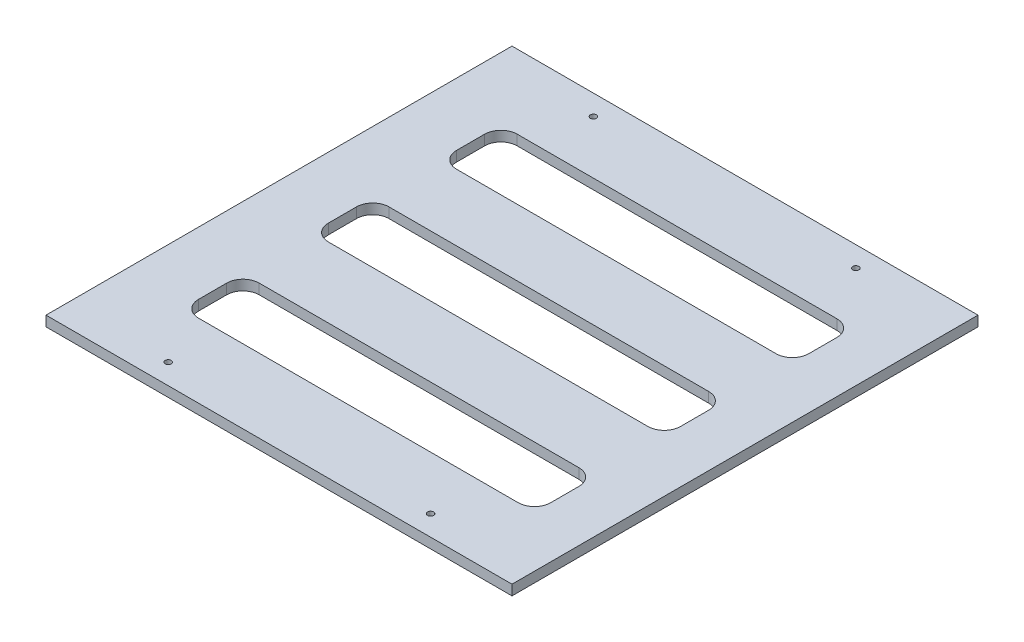
ISO-10303-21;
HEADER;
FILE_DESCRIPTION(('STEP AP214'),'2;1');
FILE_NAME('part.step','',(''),(''),'','','');
FILE_SCHEMA(('AUTOMOTIVE_DESIGN { 1 0 10303 214 1 1 1 1 }'));
ENDSEC;
DATA;
#1=APPLICATION_CONTEXT('core data for automotive mechanical design processes');
#2=APPLICATION_PROTOCOL_DEFINITION('international standard','automotive_design',2000,#1);
#3=PRODUCT_CONTEXT('',#1,'mechanical');
#4=PRODUCT('Part','Part','',(#3));
#5=PRODUCT_RELATED_PRODUCT_CATEGORY('part','',(#4));
#6=PRODUCT_DEFINITION_FORMATION('','',#4);
#7=PRODUCT_DEFINITION_CONTEXT('part definition',#1,'design');
#8=PRODUCT_DEFINITION('design','',#6,#7);
#9=PRODUCT_DEFINITION_SHAPE('','',#8);
#10=(LENGTH_UNIT() NAMED_UNIT(*) SI_UNIT(.MILLI.,.METRE.));
#11=(NAMED_UNIT(*) PLANE_ANGLE_UNIT() SI_UNIT($,.RADIAN.));
#12=(NAMED_UNIT(*) SI_UNIT($,.STERADIAN.) SOLID_ANGLE_UNIT());
#13=UNCERTAINTY_MEASURE_WITH_UNIT(LENGTH_MEASURE(1.E-05),#10,'distance_accuracy_value','');
#14=(GEOMETRIC_REPRESENTATION_CONTEXT(3) GLOBAL_UNCERTAINTY_ASSIGNED_CONTEXT((#13)) GLOBAL_UNIT_ASSIGNED_CONTEXT((#10,
#11,#12)) REPRESENTATION_CONTEXT('',''));
#15=CARTESIAN_POINT('',(0.,0.,0.));
#16=DIRECTION('',(0.,0.,1.));
#17=DIRECTION('',(1.,0.,0.));
#18=AXIS2_PLACEMENT_3D('',#15,#16,#17);
#19=CARTESIAN_POINT('',(0.,5.,0.));
#20=DIRECTION('',(0.,1.,0.));
#21=DIRECTION('',(0.,0.,1.));
#22=AXIS2_PLACEMENT_3D('',#19,#20,#21);
#23=PLANE('',#22);
#24=CARTESIAN_POINT('',(195.832686866874,5.,44.1979579462526));
#25=DIRECTION('',(0.,1.,0.));
#26=DIRECTION('',(0.,0.,1.));
#27=AXIS2_PLACEMENT_3D('',#24,#25,#26);
#28=CIRCLE('',#27,8.);
#29=CARTESIAN_POINT('',(203.832686866874,5.,44.1979579462527));
#30=VERTEX_POINT('',#29);
#31=CARTESIAN_POINT('',(195.832686866874,5.,36.1979579462526));
#32=VERTEX_POINT('',#31);
#33=EDGE_CURVE('E58',#30,#32,#28,.T.);
#34=ORIENTED_EDGE('',*,*,#33,.F.);
#35=DIRECTION('',(0.,0.,-1.));
#36=VECTOR('',#35,1.);
#37=CARTESIAN_POINT('',(203.832686866874,5.,44.1979579462527));
#38=LINE('',#37,#36);
#39=CARTESIAN_POINT('',(203.832686866874,5.,58.0273073000611));
#40=VERTEX_POINT('',#39);
#41=EDGE_CURVE('E253',#40,#30,#38,.T.);
#42=ORIENTED_EDGE('',*,*,#41,.F.);
#43=CARTESIAN_POINT('',(195.832686866874,5.,58.0273073000611));
#44=DIRECTION('',(0.,1.,0.));
#45=DIRECTION('',(0.,0.,1.));
#46=AXIS2_PLACEMENT_3D('',#43,#44,#45);
#47=CIRCLE('',#46,8.);
#48=CARTESIAN_POINT('',(195.832686866874,5.,66.0273073000611));
#49=VERTEX_POINT('',#48);
#50=EDGE_CURVE('E257',#49,#40,#47,.T.);
#51=ORIENTED_EDGE('',*,*,#50,.F.);
#52=DIRECTION('',(1.,0.,0.));
#53=VECTOR('',#52,1.);
#54=CARTESIAN_POINT('',(38.7603161369647,5.,66.0273073000611));
#55=LINE('',#54,#53);
#56=CARTESIAN_POINT('',(38.7603161369647,5.,66.0273073000611));
#57=VERTEX_POINT('',#56);
#58=EDGE_CURVE('E296',#57,#49,#55,.T.);
#59=ORIENTED_EDGE('',*,*,#58,.F.);
#60=CARTESIAN_POINT('',(38.7603161369646,5.,58.0273073000611));
#61=DIRECTION('',(0.,1.,0.));
#62=DIRECTION('',(0.,0.,1.));
#63=AXIS2_PLACEMENT_3D('',#60,#61,#62);
#64=CIRCLE('',#63,8.);
#65=CARTESIAN_POINT('',(30.7603161369646,5.,58.0273073000611));
#66=VERTEX_POINT('',#65);
#67=EDGE_CURVE('E292',#66,#57,#64,.T.);
#68=ORIENTED_EDGE('',*,*,#67,.F.);
#69=DIRECTION('',(0.,0.,1.));
#70=VECTOR('',#69,1.);
#71=CARTESIAN_POINT('',(30.7603161369646,5.,44.1979579462527));
#72=LINE('',#71,#70);
#73=CARTESIAN_POINT('',(30.7603161369646,5.,44.1979579462527));
#74=VERTEX_POINT('',#73);
#75=EDGE_CURVE('E288',#74,#66,#72,.T.);
#76=ORIENTED_EDGE('',*,*,#75,.F.);
#77=CARTESIAN_POINT('',(38.7603161369646,5.,44.1979579462526));
#78=DIRECTION('',(0.,1.,0.));
#79=DIRECTION('',(0.,0.,1.));
#80=AXIS2_PLACEMENT_3D('',#77,#78,#79);
#81=CIRCLE('',#80,8.);
#82=CARTESIAN_POINT('',(38.7603161369647,5.,36.1979579462526));
#83=VERTEX_POINT('',#82);
#84=EDGE_CURVE('E284',#83,#74,#81,.T.);
#85=ORIENTED_EDGE('',*,*,#84,.F.);
#86=DIRECTION('',(-1.,0.,0.));
#87=VECTOR('',#86,1.);
#88=CARTESIAN_POINT('',(38.7603161369647,5.,36.1979579462526));
#89=LINE('',#88,#87);
#90=EDGE_CURVE('E281',#32,#83,#89,.T.);
#91=ORIENTED_EDGE('',*,*,#90,.F.);
#92=EDGE_LOOP('',(#34,#42,#51,#59,#68,#76,#85,#91));
#93=FACE_BOUND('',#92,.T.);
#94=CARTESIAN_POINT('',(195.832686866874,5.,184.802042053747));
#95=DIRECTION('',(0.,1.,0.));
#96=DIRECTION('',(0.,0.,-1.));
#97=AXIS2_PLACEMENT_3D('',#94,#95,#96);
#98=CIRCLE('',#97,8.00000000000001);
#99=CARTESIAN_POINT('',(195.832686866874,5.,192.802042053747));
#100=VERTEX_POINT('',#99);
#101=CARTESIAN_POINT('',(203.832686866874,5.,184.802042053747));
#102=VERTEX_POINT('',#101);
#103=EDGE_CURVE('E66',#100,#102,#98,.T.);
#104=ORIENTED_EDGE('',*,*,#103,.F.);
#105=DIRECTION('',(1.,0.,0.));
#106=VECTOR('',#105,1.);
#107=CARTESIAN_POINT('',(38.7603161369646,5.,192.802042053747));
#108=LINE('',#107,#106);
#109=CARTESIAN_POINT('',(38.7603161369646,5.,192.802042053747));
#110=VERTEX_POINT('',#109);
#111=EDGE_CURVE('E350',#110,#100,#108,.T.);
#112=ORIENTED_EDGE('',*,*,#111,.F.);
#113=CARTESIAN_POINT('',(38.7603161369646,5.,184.802042053747));
#114=DIRECTION('',(0.,1.,0.));
#115=DIRECTION('',(0.,0.,-1.));
#116=AXIS2_PLACEMENT_3D('',#113,#114,#115);
#117=CIRCLE('',#116,8.);
#118=CARTESIAN_POINT('',(30.7603161369646,5.,184.802042053747));
#119=VERTEX_POINT('',#118);
#120=EDGE_CURVE('E354',#119,#110,#117,.T.);
#121=ORIENTED_EDGE('',*,*,#120,.F.);
#122=DIRECTION('',(0.,0.,1.));
#123=VECTOR('',#122,1.);
#124=CARTESIAN_POINT('',(30.7603161369646,5.,184.802042053747));
#125=LINE('',#124,#123);
#126=CARTESIAN_POINT('',(30.7603161369646,5.,170.972692699939));
#127=VERTEX_POINT('',#126);
#128=EDGE_CURVE('E359',#127,#119,#125,.T.);
#129=ORIENTED_EDGE('',*,*,#128,.F.);
#130=CARTESIAN_POINT('',(38.7603161369646,5.,170.972692699939));
#131=DIRECTION('',(0.,1.,0.));
#132=DIRECTION('',(0.,0.,-1.));
#133=AXIS2_PLACEMENT_3D('',#130,#131,#132);
#134=CIRCLE('',#133,7.99999999999998);
#135=CARTESIAN_POINT('',(38.7603161369646,5.,162.972692699939));
#136=VERTEX_POINT('',#135);
#137=EDGE_CURVE('E363',#136,#127,#134,.T.);
#138=ORIENTED_EDGE('',*,*,#137,.F.);
#139=DIRECTION('',(-1.,0.,0.));
#140=VECTOR('',#139,1.);
#141=CARTESIAN_POINT('',(38.7603161369646,5.,162.972692699939));
#142=LINE('',#141,#140);
#143=CARTESIAN_POINT('',(195.832686866874,5.,162.972692699939));
#144=VERTEX_POINT('',#143);
#145=EDGE_CURVE('E367',#144,#136,#142,.T.);
#146=ORIENTED_EDGE('',*,*,#145,.F.);
#147=CARTESIAN_POINT('',(195.832686866874,5.,170.972692699939));
#148=DIRECTION('',(0.,1.,0.));
#149=DIRECTION('',(0.,0.,-1.));
#150=AXIS2_PLACEMENT_3D('',#147,#148,#149);
#151=CIRCLE('',#150,8.00000000000001);
#152=CARTESIAN_POINT('',(203.832686866874,5.,170.972692699939));
#153=VERTEX_POINT('',#152);
#154=EDGE_CURVE('E371',#153,#144,#151,.T.);
#155=ORIENTED_EDGE('',*,*,#154,.F.);
#156=DIRECTION('',(0.,0.,-1.));
#157=VECTOR('',#156,1.);
#158=CARTESIAN_POINT('',(203.832686866874,5.,184.802042053747));
#159=LINE('',#158,#157);
#160=EDGE_CURVE('E375',#102,#153,#159,.T.);
#161=ORIENTED_EDGE('',*,*,#160,.F.);
#162=EDGE_LOOP('',(#104,#112,#121,#129,#138,#146,#155,#161));
#163=FACE_BOUND('',#162,.T.);
#164=CARTESIAN_POINT('',(195.29,5.,106.653158155789));
#165=DIRECTION('',(0.,1.,0.));
#166=DIRECTION('',(0.,0.,1.));
#167=AXIS2_PLACEMENT_3D('',#164,#165,#166);
#168=CIRCLE('',#167,8.00000000000001);
#169=CARTESIAN_POINT('',(203.29,5.,106.653158155789));
#170=VERTEX_POINT('',#169);
#171=CARTESIAN_POINT('',(195.29,5.,98.6531581557891));
#172=VERTEX_POINT('',#171);
#173=EDGE_CURVE('E349',#170,#172,#168,.T.);
#174=ORIENTED_EDGE('',*,*,#173,.F.);
#175=DIRECTION('',(0.,0.,-1.));
#176=VECTOR('',#175,1.);
#177=CARTESIAN_POINT('',(203.29,5.,106.653158155789));
#178=LINE('',#177,#176);
#179=CARTESIAN_POINT('',(203.29,5.,120.482507509598));
#180=VERTEX_POINT('',#179);
#181=EDGE_CURVE('E437',#180,#170,#178,.T.);
#182=ORIENTED_EDGE('',*,*,#181,.F.);
#183=CARTESIAN_POINT('',(195.29,5.,120.482507509598));
#184=DIRECTION('',(0.,1.,0.));
#185=DIRECTION('',(0.,0.,1.));
#186=AXIS2_PLACEMENT_3D('',#183,#184,#185);
#187=CIRCLE('',#186,8.00000000000001);
#188=CARTESIAN_POINT('',(195.29,5.,128.482507509598));
#189=VERTEX_POINT('',#188);
#190=EDGE_CURVE('E441',#189,#180,#187,.T.);
#191=ORIENTED_EDGE('',*,*,#190,.F.);
#192=DIRECTION('',(1.,0.,0.));
#193=VECTOR('',#192,1.);
#194=CARTESIAN_POINT('',(38.22,5.,128.482507509598));
#195=LINE('',#194,#193);
#196=CARTESIAN_POINT('',(38.22,5.,128.482507509598));
#197=VERTEX_POINT('',#196);
#198=EDGE_CURVE('E446',#197,#189,#195,.T.);
#199=ORIENTED_EDGE('',*,*,#198,.F.);
#200=CARTESIAN_POINT('',(38.22,5.,120.482507509598));
#201=DIRECTION('',(0.,1.,0.));
#202=DIRECTION('',(0.,0.,1.));
#203=AXIS2_PLACEMENT_3D('',#200,#201,#202);
#204=CIRCLE('',#203,8.00000000000001);
#205=CARTESIAN_POINT('',(30.22,5.,120.482507509598));
#206=VERTEX_POINT('',#205);
#207=EDGE_CURVE('E450',#206,#197,#204,.T.);
#208=ORIENTED_EDGE('',*,*,#207,.F.);
#209=DIRECTION('',(0.,0.,1.));
#210=VECTOR('',#209,1.);
#211=CARTESIAN_POINT('',(30.22,5.,106.653158155789));
#212=LINE('',#211,#210);
#213=CARTESIAN_POINT('',(30.22,5.,106.653158155789));
#214=VERTEX_POINT('',#213);
#215=EDGE_CURVE('E454',#214,#206,#212,.T.);
#216=ORIENTED_EDGE('',*,*,#215,.F.);
#217=CARTESIAN_POINT('',(38.22,5.,106.653158155789));
#218=DIRECTION('',(0.,1.,0.));
#219=DIRECTION('',(0.,0.,1.));
#220=AXIS2_PLACEMENT_3D('',#217,#218,#219);
#221=CIRCLE('',#220,8.00000000000001);
#222=CARTESIAN_POINT('',(38.22,5.,98.6531581557891));
#223=VERTEX_POINT('',#222);
#224=EDGE_CURVE('E458',#223,#214,#221,.T.);
#225=ORIENTED_EDGE('',*,*,#224,.F.);
#226=DIRECTION('',(-1.,0.,0.));
#227=VECTOR('',#226,1.);
#228=CARTESIAN_POINT('',(38.22,5.,98.6531581557891));
#229=LINE('',#228,#227);
#230=EDGE_CURVE('E462',#172,#223,#229,.T.);
#231=ORIENTED_EDGE('',*,*,#230,.F.);
#232=EDGE_LOOP('',(#174,#182,#191,#199,#208,#216,#225,#231));
#233=FACE_BOUND('',#232,.T.);
#234=CARTESIAN_POINT('',(179.,5.,219.));
#235=DIRECTION('',(0.,1.,0.));
#236=DIRECTION('',(0.,0.,-1.));
#237=AXIS2_PLACEMENT_3D('',#234,#235,#236);
#238=CIRCLE('',#237,1.5);
#239=CARTESIAN_POINT('',(179.,5.,217.5));
#240=VERTEX_POINT('',#239);
#241=EDGE_CURVE('E506',#240,#240,#238,.T.);
#242=ORIENTED_EDGE('',*,*,#241,.F.);
#243=EDGE_LOOP('',(#242));
#244=FACE_BOUND('',#243,.T.);
#245=CARTESIAN_POINT('',(179.,5.,10.));
#246=DIRECTION('',(0.,1.,0.));
#247=DIRECTION('',(0.,0.,1.));
#248=AXIS2_PLACEMENT_3D('',#245,#246,#247);
#249=CIRCLE('',#248,1.5);
#250=CARTESIAN_POINT('',(179.,5.,11.5));
#251=VERTEX_POINT('',#250);
#252=EDGE_CURVE('E522',#251,#251,#249,.T.);
#253=ORIENTED_EDGE('',*,*,#252,.F.);
#254=EDGE_LOOP('',(#253));
#255=FACE_BOUND('',#254,.T.);
#256=DIRECTION('',(0.,0.,1.));
#257=VECTOR('',#256,1.);
#258=CARTESIAN_POINT('',(0.,5.,0.));
#259=LINE('',#258,#257);
#260=CARTESIAN_POINT('',(0.,5.,0.));
#261=VERTEX_POINT('',#260);
#262=CARTESIAN_POINT('',(0.,5.,229.));
#263=VERTEX_POINT('',#262);
#264=EDGE_CURVE('E530',#261,#263,#259,.T.);
#265=ORIENTED_EDGE('',*,*,#264,.T.);
#266=DIRECTION('',(1.,0.,0.));
#267=VECTOR('',#266,1.);
#268=CARTESIAN_POINT('',(0.,5.,229.));
#269=LINE('',#268,#267);
#270=CARTESIAN_POINT('',(229.,5.,229.));
#271=VERTEX_POINT('',#270);
#272=EDGE_CURVE('E534',#263,#271,#269,.T.);
#273=ORIENTED_EDGE('',*,*,#272,.T.);
#274=DIRECTION('',(0.,0.,-1.));
#275=VECTOR('',#274,1.);
#276=CARTESIAN_POINT('',(229.,5.,0.));
#277=LINE('',#276,#275);
#278=CARTESIAN_POINT('',(229.,5.,0.));
#279=VERTEX_POINT('',#278);
#280=EDGE_CURVE('E538',#271,#279,#277,.T.);
#281=ORIENTED_EDGE('',*,*,#280,.T.);
#282=DIRECTION('',(-1.,0.,0.));
#283=VECTOR('',#282,1.);
#284=CARTESIAN_POINT('',(0.,5.,0.));
#285=LINE('',#284,#283);
#286=EDGE_CURVE('E541',#279,#261,#285,.T.);
#287=ORIENTED_EDGE('',*,*,#286,.T.);
#288=EDGE_LOOP('',(#265,#273,#281,#287));
#289=FACE_BOUND('',#288,.T.);
#290=CARTESIAN_POINT('',(50.,5.,10.));
#291=DIRECTION('',(0.,1.,0.));
#292=DIRECTION('',(0.,0.,-1.));
#293=AXIS2_PLACEMENT_3D('',#290,#291,#292);
#294=CIRCLE('',#293,1.5);
#295=CARTESIAN_POINT('',(50.,5.,8.5));
#296=VERTEX_POINT('',#295);
#297=EDGE_CURVE('E514',#296,#296,#294,.T.);
#298=ORIENTED_EDGE('',*,*,#297,.F.);
#299=EDGE_LOOP('',(#298));
#300=FACE_BOUND('',#299,.T.);
#301=CARTESIAN_POINT('',(50.,5.,219.));
#302=DIRECTION('',(0.,1.,0.));
#303=DIRECTION('',(0.,0.,1.));
#304=AXIS2_PLACEMENT_3D('',#301,#302,#303);
#305=CIRCLE('',#304,1.5);
#306=CARTESIAN_POINT('',(50.,5.,220.5));
#307=VERTEX_POINT('',#306);
#308=EDGE_CURVE('E498',#307,#307,#305,.T.);
#309=ORIENTED_EDGE('',*,*,#308,.F.);
#310=EDGE_LOOP('',(#309));
#311=FACE_BOUND('',#310,.T.);
#312=ADVANCED_FACE('F42',(#93,#163,#233,#244,#255,#289,#300,#311),#23,.T.);
#313=CARTESIAN_POINT('',(0.,0.,0.));
#314=DIRECTION('',(0.,1.,0.));
#315=DIRECTION('',(0.,0.,1.));
#316=AXIS2_PLACEMENT_3D('',#313,#314,#315);
#317=PLANE('',#316);
#318=DIRECTION('',(0.,0.,-1.));
#319=VECTOR('',#318,1.);
#320=CARTESIAN_POINT('',(203.832686866874,0.,44.1979579462527));
#321=LINE('',#320,#319);
#322=CARTESIAN_POINT('',(203.832686866874,0.,58.0273073000611));
#323=VERTEX_POINT('',#322);
#324=CARTESIAN_POINT('',(203.832686866874,0.,44.1979579462527));
#325=VERTEX_POINT('',#324);
#326=EDGE_CURVE('E237',#323,#325,#321,.T.);
#327=ORIENTED_EDGE('',*,*,#326,.T.);
#328=CARTESIAN_POINT('',(195.832686866874,0.,44.1979579462526));
#329=DIRECTION('',(0.,1.,0.));
#330=DIRECTION('',(0.,0.,1.));
#331=AXIS2_PLACEMENT_3D('',#328,#329,#330);
#332=CIRCLE('',#331,8.);
#333=CARTESIAN_POINT('',(195.832686866874,0.,36.1979579462526));
#334=VERTEX_POINT('',#333);
#335=EDGE_CURVE('E230',#325,#334,#332,.T.);
#336=ORIENTED_EDGE('',*,*,#335,.T.);
#337=DIRECTION('',(-1.,0.,0.));
#338=VECTOR('',#337,1.);
#339=CARTESIAN_POINT('',(38.7603161369647,0.,36.1979579462526));
#340=LINE('',#339,#338);
#341=CARTESIAN_POINT('',(38.7603161369647,0.,36.1979579462526));
#342=VERTEX_POINT('',#341);
#343=EDGE_CURVE('E241',#334,#342,#340,.T.);
#344=ORIENTED_EDGE('',*,*,#343,.T.);
#345=CARTESIAN_POINT('',(38.7603161369646,0.,44.1979579462526));
#346=DIRECTION('',(0.,1.,0.));
#347=DIRECTION('',(0.,0.,1.));
#348=AXIS2_PLACEMENT_3D('',#345,#346,#347);
#349=CIRCLE('',#348,8.);
#350=CARTESIAN_POINT('',(30.7603161369646,0.,44.1979579462527));
#351=VERTEX_POINT('',#350);
#352=EDGE_CURVE('E246',#342,#351,#349,.T.);
#353=ORIENTED_EDGE('',*,*,#352,.T.);
#354=DIRECTION('',(0.,0.,1.));
#355=VECTOR('',#354,1.);
#356=CARTESIAN_POINT('',(30.7603161369646,0.,44.1979579462527));
#357=LINE('',#356,#355);
#358=CARTESIAN_POINT('',(30.7603161369646,0.,58.0273073000611));
#359=VERTEX_POINT('',#358);
#360=EDGE_CURVE('E262',#351,#359,#357,.T.);
#361=ORIENTED_EDGE('',*,*,#360,.T.);
#362=CARTESIAN_POINT('',(38.7603161369646,0.,58.0273073000611));
#363=DIRECTION('',(0.,1.,0.));
#364=DIRECTION('',(0.,0.,1.));
#365=AXIS2_PLACEMENT_3D('',#362,#363,#364);
#366=CIRCLE('',#365,8.);
#367=CARTESIAN_POINT('',(38.7603161369647,0.,66.0273073000611));
#368=VERTEX_POINT('',#367);
#369=EDGE_CURVE('E266',#359,#368,#366,.T.);
#370=ORIENTED_EDGE('',*,*,#369,.T.);
#371=DIRECTION('',(1.,0.,0.));
#372=VECTOR('',#371,1.);
#373=CARTESIAN_POINT('',(38.7603161369647,0.,66.0273073000611));
#374=LINE('',#373,#372);
#375=CARTESIAN_POINT('',(195.832686866874,0.,66.0273073000611));
#376=VERTEX_POINT('',#375);
#377=EDGE_CURVE('E270',#368,#376,#374,.T.);
#378=ORIENTED_EDGE('',*,*,#377,.T.);
#379=CARTESIAN_POINT('',(195.832686866874,0.,58.0273073000611));
#380=DIRECTION('',(0.,1.,0.));
#381=DIRECTION('',(0.,0.,1.));
#382=AXIS2_PLACEMENT_3D('',#379,#380,#381);
#383=CIRCLE('',#382,8.);
#384=EDGE_CURVE('E274',#376,#323,#383,.T.);
#385=ORIENTED_EDGE('',*,*,#384,.T.);
#386=EDGE_LOOP('',(#327,#336,#344,#353,#361,#370,#378,#385));
#387=FACE_BOUND('',#386,.T.);
#388=DIRECTION('',(1.,0.,0.));
#389=VECTOR('',#388,1.);
#390=CARTESIAN_POINT('',(38.7603161369646,0.,192.802042053747));
#391=LINE('',#390,#389);
#392=CARTESIAN_POINT('',(38.7603161369646,0.,192.802042053747));
#393=VERTEX_POINT('',#392);
#394=CARTESIAN_POINT('',(195.832686866874,0.,192.802042053747));
#395=VERTEX_POINT('',#394);
#396=EDGE_CURVE('E327',#393,#395,#391,.T.);
#397=ORIENTED_EDGE('',*,*,#396,.T.);
#398=CARTESIAN_POINT('',(195.832686866874,0.,184.802042053747));
#399=DIRECTION('',(0.,1.,0.));
#400=DIRECTION('',(0.,0.,-1.));
#401=AXIS2_PLACEMENT_3D('',#398,#399,#400);
#402=CIRCLE('',#401,8.00000000000001);
#403=CARTESIAN_POINT('',(203.832686866874,0.,184.802042053747));
#404=VERTEX_POINT('',#403);
#405=EDGE_CURVE('E355',#395,#404,#402,.T.);
#406=ORIENTED_EDGE('',*,*,#405,.T.);
#407=DIRECTION('',(0.,0.,-1.));
#408=VECTOR('',#407,1.);
#409=CARTESIAN_POINT('',(203.832686866874,0.,184.802042053747));
#410=LINE('',#409,#408);
#411=CARTESIAN_POINT('',(203.832686866874,0.,170.972692699939));
#412=VERTEX_POINT('',#411);
#413=EDGE_CURVE('E404',#404,#412,#410,.T.);
#414=ORIENTED_EDGE('',*,*,#413,.T.);
#415=CARTESIAN_POINT('',(195.832686866874,0.,170.972692699939));
#416=DIRECTION('',(0.,1.,0.));
#417=DIRECTION('',(0.,0.,-1.));
#418=AXIS2_PLACEMENT_3D('',#415,#416,#417);
#419=CIRCLE('',#418,8.00000000000001);
#420=CARTESIAN_POINT('',(195.832686866874,0.,162.972692699939));
#421=VERTEX_POINT('',#420);
#422=EDGE_CURVE('E400',#412,#421,#419,.T.);
#423=ORIENTED_EDGE('',*,*,#422,.T.);
#424=DIRECTION('',(-1.,0.,0.));
#425=VECTOR('',#424,1.);
#426=CARTESIAN_POINT('',(38.7603161369646,0.,162.972692699939));
#427=LINE('',#426,#425);
#428=CARTESIAN_POINT('',(38.7603161369646,0.,162.972692699939));
#429=VERTEX_POINT('',#428);
#430=EDGE_CURVE('E396',#421,#429,#427,.T.);
#431=ORIENTED_EDGE('',*,*,#430,.T.);
#432=CARTESIAN_POINT('',(38.7603161369646,0.,170.972692699939));
#433=DIRECTION('',(0.,1.,0.));
#434=DIRECTION('',(0.,0.,-1.));
#435=AXIS2_PLACEMENT_3D('',#432,#433,#434);
#436=CIRCLE('',#435,7.99999999999998);
#437=CARTESIAN_POINT('',(30.7603161369646,0.,170.972692699939));
#438=VERTEX_POINT('',#437);
#439=EDGE_CURVE('E392',#429,#438,#436,.T.);
#440=ORIENTED_EDGE('',*,*,#439,.T.);
#441=DIRECTION('',(0.,0.,1.));
#442=VECTOR('',#441,1.);
#443=CARTESIAN_POINT('',(30.7603161369646,0.,184.802042053747));
#444=LINE('',#443,#442);
#445=CARTESIAN_POINT('',(30.7603161369646,0.,184.802042053747));
#446=VERTEX_POINT('',#445);
#447=EDGE_CURVE('E388',#438,#446,#444,.T.);
#448=ORIENTED_EDGE('',*,*,#447,.T.);
#449=CARTESIAN_POINT('',(38.7603161369646,0.,184.802042053747));
#450=DIRECTION('',(0.,1.,0.));
#451=DIRECTION('',(0.,0.,-1.));
#452=AXIS2_PLACEMENT_3D('',#449,#450,#451);
#453=CIRCLE('',#452,8.);
#454=EDGE_CURVE('E384',#446,#393,#453,.T.);
#455=ORIENTED_EDGE('',*,*,#454,.T.);
#456=EDGE_LOOP('',(#397,#406,#414,#423,#431,#440,#448,#455));
#457=FACE_BOUND('',#456,.T.);
#458=DIRECTION('',(0.,0.,-1.));
#459=VECTOR('',#458,1.);
#460=CARTESIAN_POINT('',(203.29,0.,106.653158155789));
#461=LINE('',#460,#459);
#462=CARTESIAN_POINT('',(203.29,0.,120.482507509598));
#463=VERTEX_POINT('',#462);
#464=CARTESIAN_POINT('',(203.29,0.,106.653158155789));
#465=VERTEX_POINT('',#464);
#466=EDGE_CURVE('E415',#463,#465,#461,.T.);
#467=ORIENTED_EDGE('',*,*,#466,.T.);
#468=CARTESIAN_POINT('',(195.29,0.,106.653158155789));
#469=DIRECTION('',(0.,1.,0.));
#470=DIRECTION('',(0.,0.,1.));
#471=AXIS2_PLACEMENT_3D('',#468,#469,#470);
#472=CIRCLE('',#471,8.00000000000001);
#473=CARTESIAN_POINT('',(195.29,0.,98.6531581557891));
#474=VERTEX_POINT('',#473);
#475=EDGE_CURVE('E442',#465,#474,#472,.T.);
#476=ORIENTED_EDGE('',*,*,#475,.T.);
#477=DIRECTION('',(-1.,0.,0.));
#478=VECTOR('',#477,1.);
#479=CARTESIAN_POINT('',(38.22,0.,98.6531581557891));
#480=LINE('',#479,#478);
#481=CARTESIAN_POINT('',(38.22,0.,98.6531581557891));
#482=VERTEX_POINT('',#481);
#483=EDGE_CURVE('E491',#474,#482,#480,.T.);
#484=ORIENTED_EDGE('',*,*,#483,.T.);
#485=CARTESIAN_POINT('',(38.22,0.,106.653158155789));
#486=DIRECTION('',(0.,1.,0.));
#487=DIRECTION('',(0.,0.,1.));
#488=AXIS2_PLACEMENT_3D('',#485,#486,#487);
#489=CIRCLE('',#488,8.00000000000001);
#490=CARTESIAN_POINT('',(30.22,0.,106.653158155789));
#491=VERTEX_POINT('',#490);
#492=EDGE_CURVE('E487',#482,#491,#489,.T.);
#493=ORIENTED_EDGE('',*,*,#492,.T.);
#494=DIRECTION('',(0.,0.,1.));
#495=VECTOR('',#494,1.);
#496=CARTESIAN_POINT('',(30.22,0.,106.653158155789));
#497=LINE('',#496,#495);
#498=CARTESIAN_POINT('',(30.22,0.,120.482507509598));
#499=VERTEX_POINT('',#498);
#500=EDGE_CURVE('E483',#491,#499,#497,.T.);
#501=ORIENTED_EDGE('',*,*,#500,.T.);
#502=CARTESIAN_POINT('',(38.22,0.,120.482507509598));
#503=DIRECTION('',(0.,1.,0.));
#504=DIRECTION('',(0.,0.,1.));
#505=AXIS2_PLACEMENT_3D('',#502,#503,#504);
#506=CIRCLE('',#505,8.00000000000001);
#507=CARTESIAN_POINT('',(38.22,0.,128.482507509598));
#508=VERTEX_POINT('',#507);
#509=EDGE_CURVE('E479',#499,#508,#506,.T.);
#510=ORIENTED_EDGE('',*,*,#509,.T.);
#511=DIRECTION('',(1.,0.,0.));
#512=VECTOR('',#511,1.);
#513=CARTESIAN_POINT('',(38.22,0.,128.482507509598));
#514=LINE('',#513,#512);
#515=CARTESIAN_POINT('',(195.29,0.,128.482507509598));
#516=VERTEX_POINT('',#515);
#517=EDGE_CURVE('E475',#508,#516,#514,.T.);
#518=ORIENTED_EDGE('',*,*,#517,.T.);
#519=CARTESIAN_POINT('',(195.29,0.,120.482507509598));
#520=DIRECTION('',(0.,1.,0.));
#521=DIRECTION('',(0.,0.,1.));
#522=AXIS2_PLACEMENT_3D('',#519,#520,#521);
#523=CIRCLE('',#522,8.00000000000001);
#524=EDGE_CURVE('E471',#516,#463,#523,.T.);
#525=ORIENTED_EDGE('',*,*,#524,.T.);
#526=EDGE_LOOP('',(#467,#476,#484,#493,#501,#510,#518,#525));
#527=FACE_BOUND('',#526,.T.);
#528=DIRECTION('',(0.,0.,1.));
#529=VECTOR('',#528,1.);
#530=CARTESIAN_POINT('',(0.,0.,0.));
#531=LINE('',#530,#529);
#532=CARTESIAN_POINT('',(0.,0.,0.));
#533=VERTEX_POINT('',#532);
#534=CARTESIAN_POINT('',(0.,0.,229.));
#535=VERTEX_POINT('',#534);
#536=EDGE_CURVE('E526',#533,#535,#531,.T.);
#537=ORIENTED_EDGE('',*,*,#536,.F.);
#538=DIRECTION('',(-1.,0.,0.));
#539=VECTOR('',#538,1.);
#540=CARTESIAN_POINT('',(0.,0.,0.));
#541=LINE('',#540,#539);
#542=CARTESIAN_POINT('',(229.,0.,0.));
#543=VERTEX_POINT('',#542);
#544=EDGE_CURVE('E535',#543,#533,#541,.T.);
#545=ORIENTED_EDGE('',*,*,#544,.F.);
#546=DIRECTION('',(0.,0.,-1.));
#547=VECTOR('',#546,1.);
#548=CARTESIAN_POINT('',(229.,0.,0.));
#549=LINE('',#548,#547);
#550=CARTESIAN_POINT('',(229.,0.,229.));
#551=VERTEX_POINT('',#550);
#552=EDGE_CURVE('E551',#551,#543,#549,.T.);
#553=ORIENTED_EDGE('',*,*,#552,.F.);
#554=DIRECTION('',(1.,0.,0.));
#555=VECTOR('',#554,1.);
#556=CARTESIAN_POINT('',(0.,0.,229.));
#557=LINE('',#556,#555);
#558=EDGE_CURVE('E548',#535,#551,#557,.T.);
#559=ORIENTED_EDGE('',*,*,#558,.F.);
#560=EDGE_LOOP('',(#537,#545,#553,#559));
#561=FACE_BOUND('',#560,.T.);
#562=CARTESIAN_POINT('',(179.,0.,10.));
#563=DIRECTION('',(0.,1.,0.));
#564=DIRECTION('',(0.,0.,1.));
#565=AXIS2_PLACEMENT_3D('',#562,#563,#564);
#566=CIRCLE('',#565,1.5);
#567=CARTESIAN_POINT('',(179.,0.,11.5));
#568=VERTEX_POINT('',#567);
#569=EDGE_CURVE('E518',#568,#568,#566,.T.);
#570=ORIENTED_EDGE('',*,*,#569,.T.);
#571=EDGE_LOOP('',(#570));
#572=FACE_BOUND('',#571,.T.);
#573=CARTESIAN_POINT('',(50.,0.,10.));
#574=DIRECTION('',(0.,1.,0.));
#575=DIRECTION('',(0.,0.,-1.));
#576=AXIS2_PLACEMENT_3D('',#573,#574,#575);
#577=CIRCLE('',#576,1.5);
#578=CARTESIAN_POINT('',(50.,0.,8.5));
#579=VERTEX_POINT('',#578);
#580=EDGE_CURVE('E510',#579,#579,#577,.T.);
#581=ORIENTED_EDGE('',*,*,#580,.T.);
#582=EDGE_LOOP('',(#581));
#583=FACE_BOUND('',#582,.T.);
#584=CARTESIAN_POINT('',(179.,0.,219.));
#585=DIRECTION('',(0.,1.,0.));
#586=DIRECTION('',(0.,0.,-1.));
#587=AXIS2_PLACEMENT_3D('',#584,#585,#586);
#588=CIRCLE('',#587,1.5);
#589=CARTESIAN_POINT('',(179.,0.,217.5));
#590=VERTEX_POINT('',#589);
#591=EDGE_CURVE('E502',#590,#590,#588,.T.);
#592=ORIENTED_EDGE('',*,*,#591,.T.);
#593=EDGE_LOOP('',(#592));
#594=FACE_BOUND('',#593,.T.);
#595=CARTESIAN_POINT('',(50.,0.,219.));
#596=DIRECTION('',(0.,1.,0.));
#597=DIRECTION('',(0.,0.,1.));
#598=AXIS2_PLACEMENT_3D('',#595,#596,#597);
#599=CIRCLE('',#598,1.5);
#600=CARTESIAN_POINT('',(50.,0.,220.5));
#601=VERTEX_POINT('',#600);
#602=EDGE_CURVE('E306',#601,#601,#599,.T.);
#603=ORIENTED_EDGE('',*,*,#602,.T.);
#604=EDGE_LOOP('',(#603));
#605=FACE_BOUND('',#604,.T.);
#606=ADVANCED_FACE('F248',(#387,#457,#527,#561,#572,#583,#594,#605),#317,.F.);
#607=CARTESIAN_POINT('',(0.,5.,0.));
#608=DIRECTION('',(1.,0.,0.));
#609=DIRECTION('',(0.,0.,-1.));
#610=AXIS2_PLACEMENT_3D('',#607,#608,#609);
#611=PLANE('',#610);
#612=ORIENTED_EDGE('',*,*,#536,.T.);
#613=DIRECTION('',(0.,-1.,0.));
#614=VECTOR('',#613,1.);
#615=CARTESIAN_POINT('',(0.,5.,229.));
#616=LINE('',#615,#614);
#617=EDGE_CURVE('E11',#263,#535,#616,.T.);
#618=ORIENTED_EDGE('',*,*,#617,.F.);
#619=ORIENTED_EDGE('',*,*,#264,.F.);
#620=DIRECTION('',(0.,-1.,0.));
#621=VECTOR('',#620,1.);
#622=CARTESIAN_POINT('',(0.,5.,0.));
#623=LINE('',#622,#621);
#624=EDGE_CURVE('E544',#261,#533,#623,.T.);
#625=ORIENTED_EDGE('',*,*,#624,.T.);
#626=EDGE_LOOP('',(#612,#618,#619,#625));
#627=FACE_BOUND('',#626,.T.);
#628=ADVANCED_FACE('F44',(#627),#611,.F.);
#629=CARTESIAN_POINT('',(0.,5.,229.));
#630=DIRECTION('',(0.,0.,-1.));
#631=DIRECTION('',(-1.,0.,0.));
#632=AXIS2_PLACEMENT_3D('',#629,#630,#631);
#633=PLANE('',#632);
#634=ORIENTED_EDGE('',*,*,#558,.T.);
#635=DIRECTION('',(0.,-1.,0.));
#636=VECTOR('',#635,1.);
#637=CARTESIAN_POINT('',(229.,5.,229.));
#638=LINE('',#637,#636);
#639=EDGE_CURVE('E51',#271,#551,#638,.T.);
#640=ORIENTED_EDGE('',*,*,#639,.F.);
#641=ORIENTED_EDGE('',*,*,#272,.F.);
#642=ORIENTED_EDGE('',*,*,#617,.T.);
#643=EDGE_LOOP('',(#634,#640,#641,#642));
#644=FACE_BOUND('',#643,.T.);
#645=ADVANCED_FACE('F584',(#644),#633,.F.);
#646=CARTESIAN_POINT('',(229.,5.,0.));
#647=DIRECTION('',(-1.,0.,0.));
#648=DIRECTION('',(0.,0.,1.));
#649=AXIS2_PLACEMENT_3D('',#646,#647,#648);
#650=PLANE('',#649);
#651=ORIENTED_EDGE('',*,*,#552,.T.);
#652=DIRECTION('',(0.,-1.,0.));
#653=VECTOR('',#652,1.);
#654=CARTESIAN_POINT('',(229.,5.,0.));
#655=LINE('',#654,#653);
#656=EDGE_CURVE('E559',#279,#543,#655,.T.);
#657=ORIENTED_EDGE('',*,*,#656,.F.);
#658=ORIENTED_EDGE('',*,*,#280,.F.);
#659=ORIENTED_EDGE('',*,*,#639,.T.);
#660=EDGE_LOOP('',(#651,#657,#658,#659));
#661=FACE_BOUND('',#660,.T.);
#662=ADVANCED_FACE('F568',(#661),#650,.F.);
#663=CARTESIAN_POINT('',(0.,5.,0.));
#664=DIRECTION('',(0.,0.,1.));
#665=DIRECTION('',(1.,0.,0.));
#666=AXIS2_PLACEMENT_3D('',#663,#664,#665);
#667=PLANE('',#666);
#668=ORIENTED_EDGE('',*,*,#544,.T.);
#669=ORIENTED_EDGE('',*,*,#624,.F.);
#670=ORIENTED_EDGE('',*,*,#286,.F.);
#671=ORIENTED_EDGE('',*,*,#656,.T.);
#672=EDGE_LOOP('',(#668,#669,#670,#671));
#673=FACE_BOUND('',#672,.T.);
#674=ADVANCED_FACE('F577',(#673),#667,.F.);
#675=CARTESIAN_POINT('',(179.,5.,10.));
#676=DIRECTION('',(0.,-1.,0.));
#677=DIRECTION('',(0.,0.,-1.));
#678=AXIS2_PLACEMENT_3D('',#675,#676,#677);
#679=CYLINDRICAL_SURFACE('',#678,1.5);
#680=ORIENTED_EDGE('',*,*,#252,.T.);
#681=EDGE_LOOP('',(#680));
#682=FACE_BOUND('',#681,.T.);
#683=ORIENTED_EDGE('',*,*,#569,.F.);
#684=EDGE_LOOP('',(#683));
#685=FACE_BOUND('',#684,.T.);
#686=ADVANCED_FACE('F601',(#682,#685),#679,.F.);
#687=CARTESIAN_POINT('',(50.,5.,10.));
#688=DIRECTION('',(0.,-1.,0.));
#689=DIRECTION('',(0.,0.,-1.));
#690=AXIS2_PLACEMENT_3D('',#687,#688,#689);
#691=CYLINDRICAL_SURFACE('',#690,1.5);
#692=ORIENTED_EDGE('',*,*,#297,.T.);
#693=EDGE_LOOP('',(#692));
#694=FACE_BOUND('',#693,.T.);
#695=ORIENTED_EDGE('',*,*,#580,.F.);
#696=EDGE_LOOP('',(#695));
#697=FACE_BOUND('',#696,.T.);
#698=ADVANCED_FACE('F608',(#694,#697),#691,.F.);
#699=CARTESIAN_POINT('',(179.,5.,219.));
#700=DIRECTION('',(0.,-1.,0.));
#701=DIRECTION('',(0.,0.,-1.));
#702=AXIS2_PLACEMENT_3D('',#699,#700,#701);
#703=CYLINDRICAL_SURFACE('',#702,1.5);
#704=ORIENTED_EDGE('',*,*,#241,.T.);
#705=EDGE_LOOP('',(#704));
#706=FACE_BOUND('',#705,.T.);
#707=ORIENTED_EDGE('',*,*,#591,.F.);
#708=EDGE_LOOP('',(#707));
#709=FACE_BOUND('',#708,.T.);
#710=ADVANCED_FACE('F613',(#706,#709),#703,.F.);
#711=CARTESIAN_POINT('',(50.,5.,219.));
#712=DIRECTION('',(0.,-1.,0.));
#713=DIRECTION('',(0.,0.,-1.));
#714=AXIS2_PLACEMENT_3D('',#711,#712,#713);
#715=CYLINDRICAL_SURFACE('',#714,1.5);
#716=ORIENTED_EDGE('',*,*,#308,.T.);
#717=EDGE_LOOP('',(#716));
#718=FACE_BOUND('',#717,.T.);
#719=ORIENTED_EDGE('',*,*,#602,.F.);
#720=EDGE_LOOP('',(#719));
#721=FACE_BOUND('',#720,.T.);
#722=ADVANCED_FACE('F625',(#718,#721),#715,.F.);
#723=CARTESIAN_POINT('',(195.29,0.,106.653158155789));
#724=DIRECTION('',(0.,1.,0.));
#725=DIRECTION('',(0.,0.,1.));
#726=AXIS2_PLACEMENT_3D('',#723,#724,#725);
#727=CYLINDRICAL_SURFACE('',#726,8.00000000000001);
#728=ORIENTED_EDGE('',*,*,#173,.T.);
#729=DIRECTION('',(0.,1.,0.));
#730=VECTOR('',#729,1.);
#731=CARTESIAN_POINT('',(195.29,0.,98.6531581557891));
#732=LINE('',#731,#730);
#733=EDGE_CURVE('E411',#474,#172,#732,.T.);
#734=ORIENTED_EDGE('',*,*,#733,.F.);
#735=ORIENTED_EDGE('',*,*,#475,.F.);
#736=DIRECTION('',(0.,1.,0.));
#737=VECTOR('',#736,1.);
#738=CARTESIAN_POINT('',(203.29,0.,106.653158155789));
#739=LINE('',#738,#737);
#740=EDGE_CURVE('E434',#465,#170,#739,.T.);
#741=ORIENTED_EDGE('',*,*,#740,.T.);
#742=EDGE_LOOP('',(#728,#734,#735,#741));
#743=FACE_BOUND('',#742,.T.);
#744=ADVANCED_FACE('F627',(#743),#727,.F.);
#745=CARTESIAN_POINT('',(203.29,0.,106.653158155789));
#746=DIRECTION('',(1.,0.,0.));
#747=DIRECTION('',(0.,0.,-1.));
#748=AXIS2_PLACEMENT_3D('',#745,#746,#747);
#749=PLANE('',#748);
#750=ORIENTED_EDGE('',*,*,#181,.T.);
#751=ORIENTED_EDGE('',*,*,#740,.F.);
#752=ORIENTED_EDGE('',*,*,#466,.F.);
#753=DIRECTION('',(0.,1.,0.));
#754=VECTOR('',#753,1.);
#755=CARTESIAN_POINT('',(203.29,0.,120.482507509598));
#756=LINE('',#755,#754);
#757=EDGE_CURVE('E431',#463,#180,#756,.T.);
#758=ORIENTED_EDGE('',*,*,#757,.T.);
#759=EDGE_LOOP('',(#750,#751,#752,#758));
#760=FACE_BOUND('',#759,.T.);
#761=ADVANCED_FACE('F633',(#760),#749,.F.);
#762=CARTESIAN_POINT('',(195.29,0.,120.482507509598));
#763=DIRECTION('',(0.,1.,0.));
#764=DIRECTION('',(0.,0.,1.));
#765=AXIS2_PLACEMENT_3D('',#762,#763,#764);
#766=CYLINDRICAL_SURFACE('',#765,8.00000000000001);
#767=ORIENTED_EDGE('',*,*,#190,.T.);
#768=ORIENTED_EDGE('',*,*,#757,.F.);
#769=ORIENTED_EDGE('',*,*,#524,.F.);
#770=DIRECTION('',(0.,1.,0.));
#771=VECTOR('',#770,1.);
#772=CARTESIAN_POINT('',(195.29,0.,128.482507509598));
#773=LINE('',#772,#771);
#774=EDGE_CURVE('E428',#516,#189,#773,.T.);
#775=ORIENTED_EDGE('',*,*,#774,.T.);
#776=EDGE_LOOP('',(#767,#768,#769,#775));
#777=FACE_BOUND('',#776,.T.);
#778=ADVANCED_FACE('F641',(#777),#766,.F.);
#779=CARTESIAN_POINT('',(38.22,0.,128.482507509598));
#780=DIRECTION('',(0.,0.,1.));
#781=DIRECTION('',(1.,0.,0.));
#782=AXIS2_PLACEMENT_3D('',#779,#780,#781);
#783=PLANE('',#782);
#784=ORIENTED_EDGE('',*,*,#198,.T.);
#785=ORIENTED_EDGE('',*,*,#774,.F.);
#786=ORIENTED_EDGE('',*,*,#517,.F.);
#787=DIRECTION('',(0.,1.,0.));
#788=VECTOR('',#787,1.);
#789=CARTESIAN_POINT('',(38.22,0.,128.482507509598));
#790=LINE('',#789,#788);
#791=EDGE_CURVE('E425',#508,#197,#790,.T.);
#792=ORIENTED_EDGE('',*,*,#791,.T.);
#793=EDGE_LOOP('',(#784,#785,#786,#792));
#794=FACE_BOUND('',#793,.T.);
#795=ADVANCED_FACE('F645',(#794),#783,.F.);
#796=CARTESIAN_POINT('',(38.22,0.,120.482507509598));
#797=DIRECTION('',(0.,1.,0.));
#798=DIRECTION('',(0.,0.,1.));
#799=AXIS2_PLACEMENT_3D('',#796,#797,#798);
#800=CYLINDRICAL_SURFACE('',#799,8.00000000000001);
#801=ORIENTED_EDGE('',*,*,#207,.T.);
#802=ORIENTED_EDGE('',*,*,#791,.F.);
#803=ORIENTED_EDGE('',*,*,#509,.F.);
#804=DIRECTION('',(0.,1.,0.));
#805=VECTOR('',#804,1.);
#806=CARTESIAN_POINT('',(30.22,0.,120.482507509598));
#807=LINE('',#806,#805);
#808=EDGE_CURVE('E422',#499,#206,#807,.T.);
#809=ORIENTED_EDGE('',*,*,#808,.T.);
#810=EDGE_LOOP('',(#801,#802,#803,#809));
#811=FACE_BOUND('',#810,.T.);
#812=ADVANCED_FACE('F649',(#811),#800,.F.);
#813=CARTESIAN_POINT('',(30.22,0.,106.653158155789));
#814=DIRECTION('',(-1.,0.,0.));
#815=DIRECTION('',(0.,0.,1.));
#816=AXIS2_PLACEMENT_3D('',#813,#814,#815);
#817=PLANE('',#816);
#818=ORIENTED_EDGE('',*,*,#215,.T.);
#819=ORIENTED_EDGE('',*,*,#808,.F.);
#820=ORIENTED_EDGE('',*,*,#500,.F.);
#821=DIRECTION('',(0.,1.,0.));
#822=VECTOR('',#821,1.);
#823=CARTESIAN_POINT('',(30.22,0.,106.653158155789));
#824=LINE('',#823,#822);
#825=EDGE_CURVE('E419',#491,#214,#824,.T.);
#826=ORIENTED_EDGE('',*,*,#825,.T.);
#827=EDGE_LOOP('',(#818,#819,#820,#826));
#828=FACE_BOUND('',#827,.T.);
#829=ADVANCED_FACE('F653',(#828),#817,.F.);
#830=CARTESIAN_POINT('',(38.22,0.,106.653158155789));
#831=DIRECTION('',(0.,1.,0.));
#832=DIRECTION('',(0.,0.,1.));
#833=AXIS2_PLACEMENT_3D('',#830,#831,#832);
#834=CYLINDRICAL_SURFACE('',#833,8.00000000000001);
#835=ORIENTED_EDGE('',*,*,#224,.T.);
#836=ORIENTED_EDGE('',*,*,#825,.F.);
#837=ORIENTED_EDGE('',*,*,#492,.F.);
#838=DIRECTION('',(0.,1.,0.));
#839=VECTOR('',#838,1.);
#840=CARTESIAN_POINT('',(38.22,0.,98.6531581557891));
#841=LINE('',#840,#839);
#842=EDGE_CURVE('E416',#482,#223,#841,.T.);
#843=ORIENTED_EDGE('',*,*,#842,.T.);
#844=EDGE_LOOP('',(#835,#836,#837,#843));
#845=FACE_BOUND('',#844,.T.);
#846=ADVANCED_FACE('F657',(#845),#834,.F.);
#847=CARTESIAN_POINT('',(38.22,0.,98.6531581557891));
#848=DIRECTION('',(0.,0.,-1.));
#849=DIRECTION('',(-1.,0.,0.));
#850=AXIS2_PLACEMENT_3D('',#847,#848,#849);
#851=PLANE('',#850);
#852=ORIENTED_EDGE('',*,*,#230,.T.);
#853=ORIENTED_EDGE('',*,*,#842,.F.);
#854=ORIENTED_EDGE('',*,*,#483,.F.);
#855=ORIENTED_EDGE('',*,*,#733,.T.);
#856=EDGE_LOOP('',(#852,#853,#854,#855));
#857=FACE_BOUND('',#856,.T.);
#858=ADVANCED_FACE('F661',(#857),#851,.F.);
#859=CARTESIAN_POINT('',(195.832686866874,0.,184.802042053747));
#860=DIRECTION('',(0.,1.,0.));
#861=DIRECTION('',(0.,0.,1.));
#862=AXIS2_PLACEMENT_3D('',#859,#860,#861);
#863=CYLINDRICAL_SURFACE('',#862,8.00000000000001);
#864=ORIENTED_EDGE('',*,*,#103,.T.);
#865=DIRECTION('',(0.,1.,0.));
#866=VECTOR('',#865,1.);
#867=CARTESIAN_POINT('',(203.832686866874,0.,184.802042053747));
#868=LINE('',#867,#866);
#869=EDGE_CURVE('E324',#404,#102,#868,.T.);
#870=ORIENTED_EDGE('',*,*,#869,.F.);
#871=ORIENTED_EDGE('',*,*,#405,.F.);
#872=DIRECTION('',(0.,1.,0.));
#873=VECTOR('',#872,1.);
#874=CARTESIAN_POINT('',(195.832686866874,0.,192.802042053747));
#875=LINE('',#874,#873);
#876=EDGE_CURVE('E346',#395,#100,#875,.T.);
#877=ORIENTED_EDGE('',*,*,#876,.T.);
#878=EDGE_LOOP('',(#864,#870,#871,#877));
#879=FACE_BOUND('',#878,.T.);
#880=ADVANCED_FACE('F664',(#879),#863,.F.);
#881=CARTESIAN_POINT('',(38.7603161369646,0.,192.802042053747));
#882=DIRECTION('',(0.,0.,1.));
#883=DIRECTION('',(1.,0.,0.));
#884=AXIS2_PLACEMENT_3D('',#881,#882,#883);
#885=PLANE('',#884);
#886=ORIENTED_EDGE('',*,*,#111,.T.);
#887=ORIENTED_EDGE('',*,*,#876,.F.);
#888=ORIENTED_EDGE('',*,*,#396,.F.);
#889=DIRECTION('',(0.,1.,0.));
#890=VECTOR('',#889,1.);
#891=CARTESIAN_POINT('',(38.7603161369646,0.,192.802042053747));
#892=LINE('',#891,#890);
#893=EDGE_CURVE('E343',#393,#110,#892,.T.);
#894=ORIENTED_EDGE('',*,*,#893,.T.);
#895=EDGE_LOOP('',(#886,#887,#888,#894));
#896=FACE_BOUND('',#895,.T.);
#897=ADVANCED_FACE('F667',(#896),#885,.F.);
#898=CARTESIAN_POINT('',(38.7603161369646,0.,184.802042053747));
#899=DIRECTION('',(0.,1.,0.));
#900=DIRECTION('',(0.,0.,1.));
#901=AXIS2_PLACEMENT_3D('',#898,#899,#900);
#902=CYLINDRICAL_SURFACE('',#901,8.);
#903=ORIENTED_EDGE('',*,*,#120,.T.);
#904=ORIENTED_EDGE('',*,*,#893,.F.);
#905=ORIENTED_EDGE('',*,*,#454,.F.);
#906=DIRECTION('',(0.,1.,0.));
#907=VECTOR('',#906,1.);
#908=CARTESIAN_POINT('',(30.7603161369646,0.,184.802042053747));
#909=LINE('',#908,#907);
#910=EDGE_CURVE('E340',#446,#119,#909,.T.);
#911=ORIENTED_EDGE('',*,*,#910,.T.);
#912=EDGE_LOOP('',(#903,#904,#905,#911));
#913=FACE_BOUND('',#912,.T.);
#914=ADVANCED_FACE('F670',(#913),#902,.F.);
#915=CARTESIAN_POINT('',(30.7603161369646,0.,184.802042053747));
#916=DIRECTION('',(-1.,0.,0.));
#917=DIRECTION('',(0.,0.,1.));
#918=AXIS2_PLACEMENT_3D('',#915,#916,#917);
#919=PLANE('',#918);
#920=ORIENTED_EDGE('',*,*,#128,.T.);
#921=ORIENTED_EDGE('',*,*,#910,.F.);
#922=ORIENTED_EDGE('',*,*,#447,.F.);
#923=DIRECTION('',(0.,1.,0.));
#924=VECTOR('',#923,1.);
#925=CARTESIAN_POINT('',(30.7603161369646,0.,170.972692699939));
#926=LINE('',#925,#924);
#927=EDGE_CURVE('E337',#438,#127,#926,.T.);
#928=ORIENTED_EDGE('',*,*,#927,.T.);
#929=EDGE_LOOP('',(#920,#921,#922,#928));
#930=FACE_BOUND('',#929,.T.);
#931=ADVANCED_FACE('F674',(#930),#919,.F.);
#932=CARTESIAN_POINT('',(38.7603161369646,0.,170.972692699939));
#933=DIRECTION('',(0.,1.,0.));
#934=DIRECTION('',(0.,0.,1.));
#935=AXIS2_PLACEMENT_3D('',#932,#933,#934);
#936=CYLINDRICAL_SURFACE('',#935,7.99999999999998);
#937=ORIENTED_EDGE('',*,*,#137,.T.);
#938=ORIENTED_EDGE('',*,*,#927,.F.);
#939=ORIENTED_EDGE('',*,*,#439,.F.);
#940=DIRECTION('',(0.,1.,0.));
#941=VECTOR('',#940,1.);
#942=CARTESIAN_POINT('',(38.7603161369646,0.,162.972692699939));
#943=LINE('',#942,#941);
#944=EDGE_CURVE('E334',#429,#136,#943,.T.);
#945=ORIENTED_EDGE('',*,*,#944,.T.);
#946=EDGE_LOOP('',(#937,#938,#939,#945));
#947=FACE_BOUND('',#946,.T.);
#948=ADVANCED_FACE('F678',(#947),#936,.F.);
#949=CARTESIAN_POINT('',(38.7603161369646,0.,162.972692699939));
#950=DIRECTION('',(0.,0.,-1.));
#951=DIRECTION('',(-1.,0.,0.));
#952=AXIS2_PLACEMENT_3D('',#949,#950,#951);
#953=PLANE('',#952);
#954=ORIENTED_EDGE('',*,*,#145,.T.);
#955=ORIENTED_EDGE('',*,*,#944,.F.);
#956=ORIENTED_EDGE('',*,*,#430,.F.);
#957=DIRECTION('',(0.,1.,0.));
#958=VECTOR('',#957,1.);
#959=CARTESIAN_POINT('',(195.832686866874,0.,162.972692699939));
#960=LINE('',#959,#958);
#961=EDGE_CURVE('E331',#421,#144,#960,.T.);
#962=ORIENTED_EDGE('',*,*,#961,.T.);
#963=EDGE_LOOP('',(#954,#955,#956,#962));
#964=FACE_BOUND('',#963,.T.);
#965=ADVANCED_FACE('F682',(#964),#953,.F.);
#966=CARTESIAN_POINT('',(195.832686866874,0.,170.972692699939));
#967=DIRECTION('',(0.,1.,0.));
#968=DIRECTION('',(0.,0.,1.));
#969=AXIS2_PLACEMENT_3D('',#966,#967,#968);
#970=CYLINDRICAL_SURFACE('',#969,8.00000000000001);
#971=ORIENTED_EDGE('',*,*,#154,.T.);
#972=ORIENTED_EDGE('',*,*,#961,.F.);
#973=ORIENTED_EDGE('',*,*,#422,.F.);
#974=DIRECTION('',(0.,1.,0.));
#975=VECTOR('',#974,1.);
#976=CARTESIAN_POINT('',(203.832686866874,0.,170.972692699939));
#977=LINE('',#976,#975);
#978=EDGE_CURVE('E328',#412,#153,#977,.T.);
#979=ORIENTED_EDGE('',*,*,#978,.T.);
#980=EDGE_LOOP('',(#971,#972,#973,#979));
#981=FACE_BOUND('',#980,.T.);
#982=ADVANCED_FACE('F686',(#981),#970,.F.);
#983=CARTESIAN_POINT('',(203.832686866874,0.,184.802042053747));
#984=DIRECTION('',(1.,0.,0.));
#985=DIRECTION('',(0.,0.,-1.));
#986=AXIS2_PLACEMENT_3D('',#983,#984,#985);
#987=PLANE('',#986);
#988=ORIENTED_EDGE('',*,*,#160,.T.);
#989=ORIENTED_EDGE('',*,*,#978,.F.);
#990=ORIENTED_EDGE('',*,*,#413,.F.);
#991=ORIENTED_EDGE('',*,*,#869,.T.);
#992=EDGE_LOOP('',(#988,#989,#990,#991));
#993=FACE_BOUND('',#992,.T.);
#994=ADVANCED_FACE('F690',(#993),#987,.F.);
#995=CARTESIAN_POINT('',(195.832686866874,0.,44.1979579462526));
#996=DIRECTION('',(0.,1.,0.));
#997=DIRECTION('',(0.,0.,1.));
#998=AXIS2_PLACEMENT_3D('',#995,#996,#997);
#999=CYLINDRICAL_SURFACE('',#998,8.);
#1000=ORIENTED_EDGE('',*,*,#33,.T.);
#1001=DIRECTION('',(0.,1.,0.));
#1002=VECTOR('',#1001,1.);
#1003=CARTESIAN_POINT('',(195.832686866874,0.,36.1979579462526));
#1004=LINE('',#1003,#1002);
#1005=EDGE_CURVE('E226',#334,#32,#1004,.T.);
#1006=ORIENTED_EDGE('',*,*,#1005,.F.);
#1007=ORIENTED_EDGE('',*,*,#335,.F.);
#1008=DIRECTION('',(0.,1.,0.));
#1009=VECTOR('',#1008,1.);
#1010=CARTESIAN_POINT('',(203.832686866874,0.,44.1979579462527));
#1011=LINE('',#1010,#1009);
#1012=EDGE_CURVE('E303',#325,#30,#1011,.T.);
#1013=ORIENTED_EDGE('',*,*,#1012,.T.);
#1014=EDGE_LOOP('',(#1000,#1006,#1007,#1013));
#1015=FACE_BOUND('',#1014,.T.);
#1016=ADVANCED_FACE('F228',(#1015),#999,.F.);
#1017=CARTESIAN_POINT('',(203.832686866874,0.,44.1979579462527));
#1018=DIRECTION('',(1.,0.,0.));
#1019=DIRECTION('',(0.,0.,-1.));
#1020=AXIS2_PLACEMENT_3D('',#1017,#1018,#1019);
#1021=PLANE('',#1020);
#1022=ORIENTED_EDGE('',*,*,#41,.T.);
#1023=ORIENTED_EDGE('',*,*,#1012,.F.);
#1024=ORIENTED_EDGE('',*,*,#326,.F.);
#1025=DIRECTION('',(0.,1.,0.));
#1026=VECTOR('',#1025,1.);
#1027=CARTESIAN_POINT('',(203.832686866874,0.,58.0273073000611));
#1028=LINE('',#1027,#1026);
#1029=EDGE_CURVE('E307',#323,#40,#1028,.T.);
#1030=ORIENTED_EDGE('',*,*,#1029,.T.);
#1031=EDGE_LOOP('',(#1022,#1023,#1024,#1030));
#1032=FACE_BOUND('',#1031,.T.);
#1033=ADVANCED_FACE('F699',(#1032),#1021,.F.);
#1034=CARTESIAN_POINT('',(195.832686866874,0.,58.0273073000611));
#1035=DIRECTION('',(0.,1.,0.));
#1036=DIRECTION('',(0.,0.,1.));
#1037=AXIS2_PLACEMENT_3D('',#1034,#1035,#1036);
#1038=CYLINDRICAL_SURFACE('',#1037,8.);
#1039=ORIENTED_EDGE('',*,*,#50,.T.);
#1040=ORIENTED_EDGE('',*,*,#1029,.F.);
#1041=ORIENTED_EDGE('',*,*,#384,.F.);
#1042=DIRECTION('',(0.,1.,0.));
#1043=VECTOR('',#1042,1.);
#1044=CARTESIAN_POINT('',(195.832686866874,0.,66.0273073000611));
#1045=LINE('',#1044,#1043);
#1046=EDGE_CURVE('E310',#376,#49,#1045,.T.);
#1047=ORIENTED_EDGE('',*,*,#1046,.T.);
#1048=EDGE_LOOP('',(#1039,#1040,#1041,#1047));
#1049=FACE_BOUND('',#1048,.T.);
#1050=ADVANCED_FACE('F717',(#1049),#1038,.F.);
#1051=CARTESIAN_POINT('',(38.7603161369647,0.,66.0273073000611));
#1052=DIRECTION('',(0.,0.,1.));
#1053=DIRECTION('',(1.,0.,0.));
#1054=AXIS2_PLACEMENT_3D('',#1051,#1052,#1053);
#1055=PLANE('',#1054);
#1056=ORIENTED_EDGE('',*,*,#58,.T.);
#1057=ORIENTED_EDGE('',*,*,#1046,.F.);
#1058=ORIENTED_EDGE('',*,*,#377,.F.);
#1059=DIRECTION('',(0.,1.,0.));
#1060=VECTOR('',#1059,1.);
#1061=CARTESIAN_POINT('',(38.7603161369647,0.,66.0273073000611));
#1062=LINE('',#1061,#1060);
#1063=EDGE_CURVE('E313',#368,#57,#1062,.T.);
#1064=ORIENTED_EDGE('',*,*,#1063,.T.);
#1065=EDGE_LOOP('',(#1056,#1057,#1058,#1064));
#1066=FACE_BOUND('',#1065,.T.);
#1067=ADVANCED_FACE('F713',(#1066),#1055,.F.);
#1068=CARTESIAN_POINT('',(38.7603161369646,0.,58.0273073000611));
#1069=DIRECTION('',(0.,1.,0.));
#1070=DIRECTION('',(0.,0.,1.));
#1071=AXIS2_PLACEMENT_3D('',#1068,#1069,#1070);
#1072=CYLINDRICAL_SURFACE('',#1071,8.);
#1073=ORIENTED_EDGE('',*,*,#67,.T.);
#1074=ORIENTED_EDGE('',*,*,#1063,.F.);
#1075=ORIENTED_EDGE('',*,*,#369,.F.);
#1076=DIRECTION('',(0.,1.,0.));
#1077=VECTOR('',#1076,1.);
#1078=CARTESIAN_POINT('',(30.7603161369646,0.,58.0273073000611));
#1079=LINE('',#1078,#1077);
#1080=EDGE_CURVE('E316',#359,#66,#1079,.T.);
#1081=ORIENTED_EDGE('',*,*,#1080,.T.);
#1082=EDGE_LOOP('',(#1073,#1074,#1075,#1081));
#1083=FACE_BOUND('',#1082,.T.);
#1084=ADVANCED_FACE('F709',(#1083),#1072,.F.);
#1085=CARTESIAN_POINT('',(30.7603161369646,0.,44.1979579462527));
#1086=DIRECTION('',(-1.,0.,0.));
#1087=DIRECTION('',(0.,0.,1.));
#1088=AXIS2_PLACEMENT_3D('',#1085,#1086,#1087);
#1089=PLANE('',#1088);
#1090=ORIENTED_EDGE('',*,*,#75,.T.);
#1091=ORIENTED_EDGE('',*,*,#1080,.F.);
#1092=ORIENTED_EDGE('',*,*,#360,.F.);
#1093=DIRECTION('',(0.,1.,0.));
#1094=VECTOR('',#1093,1.);
#1095=CARTESIAN_POINT('',(30.7603161369646,0.,44.1979579462527));
#1096=LINE('',#1095,#1094);
#1097=EDGE_CURVE('E319',#351,#74,#1096,.T.);
#1098=ORIENTED_EDGE('',*,*,#1097,.T.);
#1099=EDGE_LOOP('',(#1090,#1091,#1092,#1098));
#1100=FACE_BOUND('',#1099,.T.);
#1101=ADVANCED_FACE('F705',(#1100),#1089,.F.);
#1102=CARTESIAN_POINT('',(38.7603161369646,0.,44.1979579462526));
#1103=DIRECTION('',(0.,1.,0.));
#1104=DIRECTION('',(0.,0.,1.));
#1105=AXIS2_PLACEMENT_3D('',#1102,#1103,#1104);
#1106=CYLINDRICAL_SURFACE('',#1105,8.);
#1107=ORIENTED_EDGE('',*,*,#84,.T.);
#1108=ORIENTED_EDGE('',*,*,#1097,.F.);
#1109=ORIENTED_EDGE('',*,*,#352,.F.);
#1110=DIRECTION('',(0.,1.,0.));
#1111=VECTOR('',#1110,1.);
#1112=CARTESIAN_POINT('',(38.7603161369647,0.,36.1979579462526));
#1113=LINE('',#1112,#1111);
#1114=EDGE_CURVE('E236',#342,#83,#1113,.T.);
#1115=ORIENTED_EDGE('',*,*,#1114,.T.);
#1116=EDGE_LOOP('',(#1107,#1108,#1109,#1115));
#1117=FACE_BOUND('',#1116,.T.);
#1118=ADVANCED_FACE('F702',(#1117),#1106,.F.);
#1119=CARTESIAN_POINT('',(38.7603161369647,0.,36.1979579462526));
#1120=DIRECTION('',(0.,0.,-1.));
#1121=DIRECTION('',(-1.,0.,0.));
#1122=AXIS2_PLACEMENT_3D('',#1119,#1120,#1121);
#1123=PLANE('',#1122);
#1124=ORIENTED_EDGE('',*,*,#90,.T.);
#1125=ORIENTED_EDGE('',*,*,#1114,.F.);
#1126=ORIENTED_EDGE('',*,*,#343,.F.);
#1127=ORIENTED_EDGE('',*,*,#1005,.T.);
#1128=EDGE_LOOP('',(#1124,#1125,#1126,#1127));
#1129=FACE_BOUND('',#1128,.T.);
#1130=ADVANCED_FACE('F242',(#1129),#1123,.F.);
#1131=CLOSED_SHELL('',(#312,#606,#628,#645,#662,#674,#686,#698,#710,#722,#744,#761,#778,#795,
#812,#829,#846,#858,#880,#897,#914,#931,#948,#965,#982,#994,#1016,#1033,#1050,#1067,#1084,#1101,
#1118,#1130));
#1132=MANIFOLD_SOLID_BREP('B2',#1131);
#1133=ADVANCED_BREP_SHAPE_REPRESENTATION('',(#18,#1132),#14);
#1134=SHAPE_DEFINITION_REPRESENTATION(#9,#1133);
ENDSEC;
END-ISO-10303-21;
